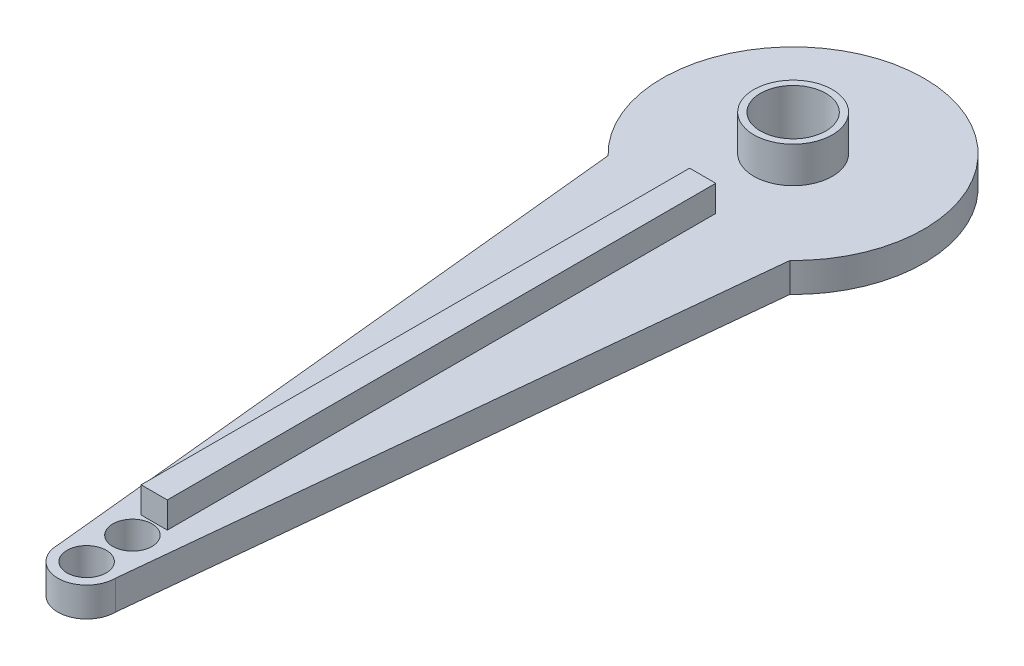
ISO-10303-21;
HEADER;
FILE_DESCRIPTION(('STEP AP214'),'2;1');
FILE_NAME('part.step','',(''),(''),'','','');
FILE_SCHEMA(('AUTOMOTIVE_DESIGN { 1 0 10303 214 1 1 1 1 }'));
ENDSEC;
DATA;
#1=APPLICATION_CONTEXT('core data for automotive mechanical design processes');
#2=APPLICATION_PROTOCOL_DEFINITION('international standard','automotive_design',2000,#1);
#3=PRODUCT_CONTEXT('',#1,'mechanical');
#4=PRODUCT('Part','Part','',(#3));
#5=PRODUCT_RELATED_PRODUCT_CATEGORY('part','',(#4));
#6=PRODUCT_DEFINITION_FORMATION('','',#4);
#7=PRODUCT_DEFINITION_CONTEXT('part definition',#1,'design');
#8=PRODUCT_DEFINITION('design','',#6,#7);
#9=PRODUCT_DEFINITION_SHAPE('','',#8);
#10=(LENGTH_UNIT() NAMED_UNIT(*) SI_UNIT(.MILLI.,.METRE.));
#11=(NAMED_UNIT(*) PLANE_ANGLE_UNIT() SI_UNIT($,.RADIAN.));
#12=(NAMED_UNIT(*) SI_UNIT($,.STERADIAN.) SOLID_ANGLE_UNIT());
#13=UNCERTAINTY_MEASURE_WITH_UNIT(LENGTH_MEASURE(1.E-05),#10,'distance_accuracy_value','');
#14=(GEOMETRIC_REPRESENTATION_CONTEXT(3) GLOBAL_UNCERTAINTY_ASSIGNED_CONTEXT((#13)) GLOBAL_UNIT_ASSIGNED_CONTEXT((#10,
#11,#12)) REPRESENTATION_CONTEXT('',''));
#15=CARTESIAN_POINT('',(0.,0.,0.));
#16=DIRECTION('',(0.,0.,1.));
#17=DIRECTION('',(1.,0.,0.));
#18=AXIS2_PLACEMENT_3D('',#15,#16,#17);
#19=CARTESIAN_POINT('',(0.,1.,0.));
#20=DIRECTION('',(0.,-1.,0.));
#21=DIRECTION('',(0.,0.,-1.));
#22=AXIS2_PLACEMENT_3D('',#19,#20,#21);
#23=PLANE('',#22);
#24=CARTESIAN_POINT('',(0.,1.,0.));
#25=DIRECTION('',(0.,-1.,0.));
#26=DIRECTION('',(0.,0.,-1.));
#27=AXIS2_PLACEMENT_3D('',#24,#25,#26);
#28=CIRCLE('',#27,2.00852796678638);
#29=CARTESIAN_POINT('',(0.,1.,-2.00852796678638));
#30=VERTEX_POINT('',#29);
#31=EDGE_CURVE('E163',#30,#30,#28,.T.);
#32=ORIENTED_EDGE('',*,*,#31,.T.);
#33=EDGE_LOOP('',(#32));
#34=FACE_BOUND('',#33,.T.);
#35=CARTESIAN_POINT('',(0.,1.,0.));
#36=DIRECTION('',(0.,1.,0.));
#37=DIRECTION('',(0.,0.,1.));
#38=AXIS2_PLACEMENT_3D('',#35,#36,#37);
#39=CIRCLE('',#38,2.5);
#40=CARTESIAN_POINT('',(0.,1.,2.5));
#41=VERTEX_POINT('',#40);
#42=EDGE_CURVE('E420',#41,#41,#39,.T.);
#43=ORIENTED_EDGE('',*,*,#42,.T.);
#44=EDGE_LOOP('',(#43));
#45=FACE_BOUND('',#44,.T.);
#46=ADVANCED_FACE('F49',(#34,#45),#23,.F.);
#47=CARTESIAN_POINT('',(0.,2.25,0.));
#48=DIRECTION('',(0.,1.,0.));
#49=DIRECTION('',(0.,0.,1.));
#50=AXIS2_PLACEMENT_3D('',#47,#48,#49);
#51=PLANE('',#50);
#52=DIRECTION('',(-1.,0.,0.));
#53=VECTOR('',#52,1.);
#54=CARTESIAN_POINT('',(-0.999999999999998,2.25,6.91467437760084));
#55=LINE('',#54,#53);
#56=CARTESIAN_POINT('',(1.,2.25,6.91467437760084));
#57=VERTEX_POINT('',#56);
#58=CARTESIAN_POINT('',(-0.999999999999998,2.25,6.91467437760084));
#59=VERTEX_POINT('',#58);
#60=EDGE_CURVE('E120',#57,#59,#55,.T.);
#61=ORIENTED_EDGE('',*,*,#60,.F.);
#62=DIRECTION('',(0.,0.,-1.));
#63=VECTOR('',#62,1.);
#64=CARTESIAN_POINT('',(1.,2.25,48.8343668284656));
#65=LINE('',#64,#63);
#66=CARTESIAN_POINT('',(1.,2.25,48.8343668284656));
#67=VERTEX_POINT('',#66);
#68=EDGE_CURVE('E71',#67,#57,#65,.T.);
#69=ORIENTED_EDGE('',*,*,#68,.F.);
#70=DIRECTION('',(1.,0.,0.));
#71=VECTOR('',#70,1.);
#72=CARTESIAN_POINT('',(-1.,2.25,48.8343668284656));
#73=LINE('',#72,#71);
#74=CARTESIAN_POINT('',(-1.,2.25,48.8343668284656));
#75=VERTEX_POINT('',#74);
#76=EDGE_CURVE('E139',#75,#67,#73,.T.);
#77=ORIENTED_EDGE('',*,*,#76,.F.);
#78=DIRECTION('',(0.,0.,1.));
#79=VECTOR('',#78,1.);
#80=CARTESIAN_POINT('',(-1.,2.25,48.8343668284656));
#81=LINE('',#80,#79);
#82=EDGE_CURVE('E64',#59,#75,#81,.T.);
#83=ORIENTED_EDGE('',*,*,#82,.F.);
#84=EDGE_LOOP('',(#61,#69,#77,#83));
#85=FACE_BOUND('',#84,.T.);
#86=CARTESIAN_POINT('',(0.,2.25,54.));
#87=DIRECTION('',(0.,1.,0.));
#88=DIRECTION('',(0.,0.,1.));
#89=AXIS2_PLACEMENT_3D('',#86,#87,#88);
#90=CIRCLE('',#89,1.5);
#91=CARTESIAN_POINT('',(0.,2.25,55.5));
#92=VERTEX_POINT('',#91);
#93=EDGE_CURVE('E175',#92,#92,#90,.T.);
#94=ORIENTED_EDGE('',*,*,#93,.F.);
#95=EDGE_LOOP('',(#94));
#96=FACE_BOUND('',#95,.T.);
#97=CARTESIAN_POINT('',(0.,2.25,0.));
#98=DIRECTION('',(0.,1.,0.));
#99=DIRECTION('',(0.,0.,1.));
#100=AXIS2_PLACEMENT_3D('',#97,#98,#99);
#101=CIRCLE('',#100,10.);
#102=CARTESIAN_POINT('',(6.94444444444444,2.25,7.19546324832701));
#103=VERTEX_POINT('',#102);
#104=CARTESIAN_POINT('',(-6.94444444444444,2.25,7.19546324832701));
#105=VERTEX_POINT('',#104);
#106=EDGE_CURVE('E181',#103,#105,#101,.T.);
#107=ORIENTED_EDGE('',*,*,#106,.T.);
#108=DIRECTION('',(0.100850381456215,0.,0.99490160345641));
#109=VECTOR('',#108,1.);
#110=CARTESIAN_POINT('',(-6.94444444444444,2.25,7.19546324832701));
#111=LINE('',#110,#109);
#112=CARTESIAN_POINT('',(-2.19999999999999,2.25,54.));
#113=VERTEX_POINT('',#112);
#114=EDGE_CURVE('E184',#105,#113,#111,.T.);
#115=ORIENTED_EDGE('',*,*,#114,.T.);
#116=CARTESIAN_POINT('',(0.,2.25,54.));
#117=DIRECTION('',(0.,1.,0.));
#118=DIRECTION('',(0.,0.,1.));
#119=AXIS2_PLACEMENT_3D('',#116,#117,#118);
#120=CIRCLE('',#119,2.19999999999999);
#121=CARTESIAN_POINT('',(2.2,2.25,54.));
#122=VERTEX_POINT('',#121);
#123=EDGE_CURVE('E187',#113,#122,#120,.T.);
#124=ORIENTED_EDGE('',*,*,#123,.T.);
#125=DIRECTION('',(0.100850381456215,0.,-0.99490160345641));
#126=VECTOR('',#125,1.);
#127=CARTESIAN_POINT('',(2.19999999999999,2.25,54.));
#128=LINE('',#127,#126);
#129=EDGE_CURVE('E189',#122,#103,#128,.T.);
#130=ORIENTED_EDGE('',*,*,#129,.T.);
#131=EDGE_LOOP('',(#107,#115,#124,#130));
#132=FACE_BOUND('',#131,.T.);
#133=CARTESIAN_POINT('',(0.,2.25,50.5));
#134=DIRECTION('',(0.,1.,0.));
#135=DIRECTION('',(0.,0.,1.));
#136=AXIS2_PLACEMENT_3D('',#133,#134,#135);
#137=CIRCLE('',#136,1.5);
#138=CARTESIAN_POINT('',(0.,2.25,52.));
#139=VERTEX_POINT('',#138);
#140=EDGE_CURVE('E169',#139,#139,#137,.T.);
#141=ORIENTED_EDGE('',*,*,#140,.F.);
#142=EDGE_LOOP('',(#141));
#143=FACE_BOUND('',#142,.T.);
#144=CARTESIAN_POINT('',(0.,2.25,0.));
#145=DIRECTION('',(0.,1.,0.));
#146=DIRECTION('',(0.,0.,1.));
#147=AXIS2_PLACEMENT_3D('',#144,#145,#146);
#148=CIRCLE('',#147,3.);
#149=CARTESIAN_POINT('',(0.,2.25,3.));
#150=VERTEX_POINT('',#149);
#151=EDGE_CURVE('E144',#150,#150,#148,.T.);
#152=ORIENTED_EDGE('',*,*,#151,.F.);
#153=EDGE_LOOP('',(#152));
#154=FACE_BOUND('',#153,.T.);
#155=ADVANCED_FACE('F224',(#85,#96,#132,#143,#154),#51,.T.);
#156=CARTESIAN_POINT('',(0.,0.,0.));
#157=DIRECTION('',(0.,1.,0.));
#158=DIRECTION('',(0.,0.,1.));
#159=AXIS2_PLACEMENT_3D('',#156,#157,#158);
#160=PLANE('',#159);
#161=CARTESIAN_POINT('',(0.,0.,0.));
#162=DIRECTION('',(0.,-1.,0.));
#163=DIRECTION('',(0.,0.,-1.));
#164=AXIS2_PLACEMENT_3D('',#161,#162,#163);
#165=CIRCLE('',#164,2.00852796678638);
#166=CARTESIAN_POINT('',(0.,0.,-2.00852796678638));
#167=VERTEX_POINT('',#166);
#168=EDGE_CURVE('E160',#167,#167,#165,.T.);
#169=ORIENTED_EDGE('',*,*,#168,.F.);
#170=EDGE_LOOP('',(#169));
#171=FACE_BOUND('',#170,.T.);
#172=CARTESIAN_POINT('',(0.,0.,0.));
#173=DIRECTION('',(0.,-1.,0.));
#174=DIRECTION('',(0.,0.,-1.));
#175=AXIS2_PLACEMENT_3D('',#172,#173,#174);
#176=CIRCLE('',#175,3.);
#177=CARTESIAN_POINT('',(0.,0.,-3.));
#178=VERTEX_POINT('',#177);
#179=EDGE_CURVE('E150',#178,#178,#176,.T.);
#180=ORIENTED_EDGE('',*,*,#179,.T.);
#181=EDGE_LOOP('',(#180));
#182=FACE_BOUND('',#181,.T.);
#183=ADVANCED_FACE('F241',(#171,#182),#160,.F.);
#184=CARTESIAN_POINT('',(0.,0.,0.));
#185=DIRECTION('',(0.,-1.,0.));
#186=DIRECTION('',(0.,0.,-1.));
#187=AXIS2_PLACEMENT_3D('',#184,#185,#186);
#188=CIRCLE('',#187,3.8);
#189=CARTESIAN_POINT('',(0.,0.,-3.8));
#190=VERTEX_POINT('',#189);
#191=EDGE_CURVE('E154',#190,#190,#188,.T.);
#192=ORIENTED_EDGE('',*,*,#191,.F.);
#193=EDGE_LOOP('',(#192));
#194=FACE_BOUND('',#193,.T.);
#195=CARTESIAN_POINT('',(0.,0.,0.));
#196=DIRECTION('',(0.,1.,0.));
#197=DIRECTION('',(0.,0.,1.));
#198=AXIS2_PLACEMENT_3D('',#195,#196,#197);
#199=CIRCLE('',#198,10.);
#200=CARTESIAN_POINT('',(6.94444444444444,0.,7.19546324832701));
#201=VERTEX_POINT('',#200);
#202=CARTESIAN_POINT('',(-6.94444444444444,0.,7.19546324832701));
#203=VERTEX_POINT('',#202);
#204=EDGE_CURVE('E178',#201,#203,#199,.T.);
#205=ORIENTED_EDGE('',*,*,#204,.F.);
#206=DIRECTION('',(0.100850381456215,0.,-0.99490160345641));
#207=VECTOR('',#206,1.);
#208=CARTESIAN_POINT('',(2.19999999999999,0.,54.));
#209=LINE('',#208,#207);
#210=CARTESIAN_POINT('',(2.2,0.,54.));
#211=VERTEX_POINT('',#210);
#212=EDGE_CURVE('E185',#211,#201,#209,.T.);
#213=ORIENTED_EDGE('',*,*,#212,.F.);
#214=CARTESIAN_POINT('',(0.,0.,54.));
#215=DIRECTION('',(0.,1.,0.));
#216=DIRECTION('',(0.,0.,1.));
#217=AXIS2_PLACEMENT_3D('',#214,#215,#216);
#218=CIRCLE('',#217,2.19999999999999);
#219=CARTESIAN_POINT('',(-2.19999999999999,0.,54.));
#220=VERTEX_POINT('',#219);
#221=EDGE_CURVE('E196',#220,#211,#218,.T.);
#222=ORIENTED_EDGE('',*,*,#221,.F.);
#223=DIRECTION('',(0.100850381456215,0.,0.99490160345641));
#224=VECTOR('',#223,1.);
#225=CARTESIAN_POINT('',(-6.94444444444444,0.,7.19546324832701));
#226=LINE('',#225,#224);
#227=EDGE_CURVE('E194',#203,#220,#226,.T.);
#228=ORIENTED_EDGE('',*,*,#227,.F.);
#229=EDGE_LOOP('',(#205,#213,#222,#228));
#230=FACE_BOUND('',#229,.T.);
#231=CARTESIAN_POINT('',(0.,0.,54.));
#232=DIRECTION('',(0.,1.,0.));
#233=DIRECTION('',(0.,0.,1.));
#234=AXIS2_PLACEMENT_3D('',#231,#232,#233);
#235=CIRCLE('',#234,1.5);
#236=CARTESIAN_POINT('',(0.,0.,55.5));
#237=VERTEX_POINT('',#236);
#238=EDGE_CURVE('E172',#237,#237,#235,.T.);
#239=ORIENTED_EDGE('',*,*,#238,.T.);
#240=EDGE_LOOP('',(#239));
#241=FACE_BOUND('',#240,.T.);
#242=CARTESIAN_POINT('',(0.,0.,50.5));
#243=DIRECTION('',(0.,1.,0.));
#244=DIRECTION('',(0.,0.,1.));
#245=AXIS2_PLACEMENT_3D('',#242,#243,#244);
#246=CIRCLE('',#245,1.5);
#247=CARTESIAN_POINT('',(0.,0.,52.));
#248=VERTEX_POINT('',#247);
#249=EDGE_CURVE('E166',#248,#248,#246,.T.);
#250=ORIENTED_EDGE('',*,*,#249,.T.);
#251=EDGE_LOOP('',(#250));
#252=FACE_BOUND('',#251,.T.);
#253=ADVANCED_FACE('F214',(#194,#230,#241,#252),#160,.F.);
#254=CARTESIAN_POINT('',(0.,2.25,0.));
#255=DIRECTION('',(0.,-1.,0.));
#256=DIRECTION('',(0.,0.,-1.));
#257=AXIS2_PLACEMENT_3D('',#254,#255,#256);
#258=CYLINDRICAL_SURFACE('',#257,10.);
#259=ORIENTED_EDGE('',*,*,#204,.T.);
#260=DIRECTION('',(0.,-1.,0.));
#261=VECTOR('',#260,1.);
#262=CARTESIAN_POINT('',(-6.94444444444444,2.25,7.19546324832701));
#263=LINE('',#262,#261);
#264=EDGE_CURVE('E11',#105,#203,#263,.T.);
#265=ORIENTED_EDGE('',*,*,#264,.F.);
#266=ORIENTED_EDGE('',*,*,#106,.F.);
#267=DIRECTION('',(0.,-1.,0.));
#268=VECTOR('',#267,1.);
#269=CARTESIAN_POINT('',(6.94444444444444,2.25,7.19546324832701));
#270=LINE('',#269,#268);
#271=EDGE_CURVE('E191',#103,#201,#270,.T.);
#272=ORIENTED_EDGE('',*,*,#271,.T.);
#273=EDGE_LOOP('',(#259,#265,#266,#272));
#274=FACE_BOUND('',#273,.T.);
#275=ADVANCED_FACE('F51',(#274),#258,.T.);
#276=CARTESIAN_POINT('',(-6.94444444444444,2.25,7.19546324832701));
#277=DIRECTION('',(0.99490160345641,0.,-0.100850381456215));
#278=DIRECTION('',(-0.100850381456215,0.,-0.99490160345641));
#279=AXIS2_PLACEMENT_3D('',#276,#277,#278);
#280=PLANE('',#279);
#281=ORIENTED_EDGE('',*,*,#227,.T.);
#282=DIRECTION('',(0.,-1.,0.));
#283=VECTOR('',#282,1.);
#284=CARTESIAN_POINT('',(-2.19999999999999,2.25,54.));
#285=LINE('',#284,#283);
#286=EDGE_CURVE('E57',#113,#220,#285,.T.);
#287=ORIENTED_EDGE('',*,*,#286,.F.);
#288=ORIENTED_EDGE('',*,*,#114,.F.);
#289=ORIENTED_EDGE('',*,*,#264,.T.);
#290=EDGE_LOOP('',(#281,#287,#288,#289));
#291=FACE_BOUND('',#290,.T.);
#292=ADVANCED_FACE('F226',(#291),#280,.F.);
#293=CARTESIAN_POINT('',(0.,2.25,54.));
#294=DIRECTION('',(0.,-1.,0.));
#295=DIRECTION('',(0.,0.,-1.));
#296=AXIS2_PLACEMENT_3D('',#293,#294,#295);
#297=CYLINDRICAL_SURFACE('',#296,2.19999999999999);
#298=ORIENTED_EDGE('',*,*,#221,.T.);
#299=DIRECTION('',(0.,-1.,0.));
#300=VECTOR('',#299,1.);
#301=CARTESIAN_POINT('',(2.2,2.25,54.));
#302=LINE('',#301,#300);
#303=EDGE_CURVE('E201',#122,#211,#302,.T.);
#304=ORIENTED_EDGE('',*,*,#303,.F.);
#305=ORIENTED_EDGE('',*,*,#123,.F.);
#306=ORIENTED_EDGE('',*,*,#286,.T.);
#307=EDGE_LOOP('',(#298,#304,#305,#306));
#308=FACE_BOUND('',#307,.T.);
#309=ADVANCED_FACE('F208',(#308),#297,.T.);
#310=CARTESIAN_POINT('',(2.19999999999999,2.25,54.));
#311=DIRECTION('',(-0.99490160345641,0.,-0.100850381456215));
#312=DIRECTION('',(-0.100850381456215,0.,0.99490160345641));
#313=AXIS2_PLACEMENT_3D('',#310,#311,#312);
#314=PLANE('',#313);
#315=ORIENTED_EDGE('',*,*,#212,.T.);
#316=ORIENTED_EDGE('',*,*,#271,.F.);
#317=ORIENTED_EDGE('',*,*,#129,.F.);
#318=ORIENTED_EDGE('',*,*,#303,.T.);
#319=EDGE_LOOP('',(#315,#316,#317,#318));
#320=FACE_BOUND('',#319,.T.);
#321=ADVANCED_FACE('F218',(#320),#314,.F.);
#322=CARTESIAN_POINT('',(0.,2.25,54.));
#323=DIRECTION('',(0.,-1.,0.));
#324=DIRECTION('',(0.,0.,-1.));
#325=AXIS2_PLACEMENT_3D('',#322,#323,#324);
#326=CYLINDRICAL_SURFACE('',#325,1.5);
#327=ORIENTED_EDGE('',*,*,#93,.T.);
#328=EDGE_LOOP('',(#327));
#329=FACE_BOUND('',#328,.T.);
#330=ORIENTED_EDGE('',*,*,#238,.F.);
#331=EDGE_LOOP('',(#330));
#332=FACE_BOUND('',#331,.T.);
#333=ADVANCED_FACE('F251',(#329,#332),#326,.F.);
#334=CARTESIAN_POINT('',(0.,2.25,50.5));
#335=DIRECTION('',(0.,-1.,0.));
#336=DIRECTION('',(0.,0.,-1.));
#337=AXIS2_PLACEMENT_3D('',#334,#335,#336);
#338=CYLINDRICAL_SURFACE('',#337,1.5);
#339=ORIENTED_EDGE('',*,*,#140,.T.);
#340=EDGE_LOOP('',(#339));
#341=FACE_BOUND('',#340,.T.);
#342=ORIENTED_EDGE('',*,*,#249,.F.);
#343=EDGE_LOOP('',(#342));
#344=FACE_BOUND('',#343,.T.);
#345=ADVANCED_FACE('F248',(#341,#344),#338,.F.);
#346=CARTESIAN_POINT('',(0.,1.,0.));
#347=DIRECTION('',(0.,-1.,0.));
#348=DIRECTION('',(0.,0.,-1.));
#349=AXIS2_PLACEMENT_3D('',#346,#347,#348);
#350=CYLINDRICAL_SURFACE('',#349,2.00852796678638);
#351=ORIENTED_EDGE('',*,*,#31,.F.);
#352=EDGE_LOOP('',(#351));
#353=FACE_BOUND('',#352,.T.);
#354=ORIENTED_EDGE('',*,*,#168,.T.);
#355=EDGE_LOOP('',(#354));
#356=FACE_BOUND('',#355,.T.);
#357=ADVANCED_FACE('F246',(#353,#356),#350,.F.);
#358=CARTESIAN_POINT('',(0.,0.5,0.));
#359=DIRECTION('',(0.,-1.,0.));
#360=DIRECTION('',(0.,0.,-1.));
#361=AXIS2_PLACEMENT_3D('',#358,#359,#360);
#362=CYLINDRICAL_SURFACE('',#361,3.8);
#363=CARTESIAN_POINT('',(0.,0.5,0.));
#364=DIRECTION('',(0.,-1.,0.));
#365=DIRECTION('',(0.,0.,-1.));
#366=AXIS2_PLACEMENT_3D('',#363,#364,#365);
#367=CIRCLE('',#366,3.8);
#368=CARTESIAN_POINT('',(0.,0.5,-3.8));
#369=VERTEX_POINT('',#368);
#370=EDGE_CURVE('E157',#369,#369,#367,.T.);
#371=ORIENTED_EDGE('',*,*,#370,.F.);
#372=EDGE_LOOP('',(#371));
#373=FACE_BOUND('',#372,.T.);
#374=ORIENTED_EDGE('',*,*,#191,.T.);
#375=EDGE_LOOP('',(#374));
#376=FACE_BOUND('',#375,.T.);
#377=ADVANCED_FACE('F282',(#373,#376),#362,.F.);
#378=CARTESIAN_POINT('',(0.,0.5,0.));
#379=DIRECTION('',(0.,-1.,0.));
#380=DIRECTION('',(0.,0.,-1.));
#381=AXIS2_PLACEMENT_3D('',#378,#379,#380);
#382=PLANE('',#381);
#383=CARTESIAN_POINT('',(0.,0.5,0.));
#384=DIRECTION('',(0.,-1.,0.));
#385=DIRECTION('',(0.,0.,-1.));
#386=AXIS2_PLACEMENT_3D('',#383,#384,#385);
#387=CIRCLE('',#386,3.);
#388=CARTESIAN_POINT('',(0.,0.5,-3.));
#389=VERTEX_POINT('',#388);
#390=EDGE_CURVE('E151',#389,#389,#387,.T.);
#391=ORIENTED_EDGE('',*,*,#390,.F.);
#392=EDGE_LOOP('',(#391));
#393=FACE_BOUND('',#392,.T.);
#394=ORIENTED_EDGE('',*,*,#370,.T.);
#395=EDGE_LOOP('',(#394));
#396=FACE_BOUND('',#395,.T.);
#397=ADVANCED_FACE('F310',(#393,#396),#382,.T.);
#398=CARTESIAN_POINT('',(0.,0.5,0.));
#399=DIRECTION('',(0.,-1.,0.));
#400=DIRECTION('',(0.,0.,-1.));
#401=AXIS2_PLACEMENT_3D('',#398,#399,#400);
#402=CYLINDRICAL_SURFACE('',#401,3.);
#403=ORIENTED_EDGE('',*,*,#390,.T.);
#404=EDGE_LOOP('',(#403));
#405=FACE_BOUND('',#404,.T.);
#406=ORIENTED_EDGE('',*,*,#179,.F.);
#407=EDGE_LOOP('',(#406));
#408=FACE_BOUND('',#407,.T.);
#409=ADVANCED_FACE('F317',(#405,#408),#402,.T.);
#410=CARTESIAN_POINT('',(1.,4.25,48.8343668284656));
#411=DIRECTION('',(-1.,0.,0.));
#412=DIRECTION('',(0.,0.,1.));
#413=AXIS2_PLACEMENT_3D('',#410,#411,#412);
#414=PLANE('',#413);
#415=ORIENTED_EDGE('',*,*,#68,.T.);
#416=DIRECTION('',(0.,1.,0.));
#417=VECTOR('',#416,1.);
#418=CARTESIAN_POINT('',(1.,-1.49503218533484,6.91467437760084));
#419=LINE('',#418,#417);
#420=CARTESIAN_POINT('',(1.,4.25,6.91467437760084));
#421=VERTEX_POINT('',#420);
#422=EDGE_CURVE('E122',#57,#421,#419,.T.);
#423=ORIENTED_EDGE('',*,*,#422,.T.);
#424=DIRECTION('',(0.,0.,-1.));
#425=VECTOR('',#424,1.);
#426=CARTESIAN_POINT('',(1.,4.25,48.8343668284656));
#427=LINE('',#426,#425);
#428=CARTESIAN_POINT('',(1.,4.25,48.8343668284656));
#429=VERTEX_POINT('',#428);
#430=EDGE_CURVE('E129',#429,#421,#427,.T.);
#431=ORIENTED_EDGE('',*,*,#430,.F.);
#432=DIRECTION('',(0.,-1.,0.));
#433=VECTOR('',#432,1.);
#434=CARTESIAN_POINT('',(1.,4.25,48.8343668284656));
#435=LINE('',#434,#433);
#436=EDGE_CURVE('E137',#429,#67,#435,.T.);
#437=ORIENTED_EDGE('',*,*,#436,.T.);
#438=EDGE_LOOP('',(#415,#423,#431,#437));
#439=FACE_BOUND('',#438,.T.);
#440=ADVANCED_FACE('F325',(#439),#414,.F.);
#441=CARTESIAN_POINT('',(-1.,4.25,48.8343668284656));
#442=DIRECTION('',(1.,0.,0.));
#443=DIRECTION('',(0.,0.,-1.));
#444=AXIS2_PLACEMENT_3D('',#441,#442,#443);
#445=PLANE('',#444);
#446=DIRECTION('',(0.,0.,1.));
#447=VECTOR('',#446,1.);
#448=CARTESIAN_POINT('',(-1.,4.25,48.8343668284656));
#449=LINE('',#448,#447);
#450=CARTESIAN_POINT('',(-0.999999999999998,4.25,6.91467437760084));
#451=VERTEX_POINT('',#450);
#452=CARTESIAN_POINT('',(-1.,4.25,48.8343668284656));
#453=VERTEX_POINT('',#452);
#454=EDGE_CURVE('E127',#451,#453,#449,.T.);
#455=ORIENTED_EDGE('',*,*,#454,.F.);
#456=DIRECTION('',(0.,1.,0.));
#457=VECTOR('',#456,1.);
#458=CARTESIAN_POINT('',(-0.999999999999998,-1.49503218533484,6.91467437760084));
#459=LINE('',#458,#457);
#460=EDGE_CURVE('E115',#59,#451,#459,.T.);
#461=ORIENTED_EDGE('',*,*,#460,.F.);
#462=ORIENTED_EDGE('',*,*,#82,.T.);
#463=DIRECTION('',(0.,-1.,0.));
#464=VECTOR('',#463,1.);
#465=CARTESIAN_POINT('',(-1.,4.25,48.8343668284656));
#466=LINE('',#465,#464);
#467=EDGE_CURVE('E133',#453,#75,#466,.T.);
#468=ORIENTED_EDGE('',*,*,#467,.F.);
#469=EDGE_LOOP('',(#455,#461,#462,#468));
#470=FACE_BOUND('',#469,.T.);
#471=ADVANCED_FACE('F131',(#470),#445,.F.);
#472=CARTESIAN_POINT('',(-1.,4.25,48.8343668284656));
#473=DIRECTION('',(0.,0.,-1.));
#474=DIRECTION('',(-1.,0.,0.));
#475=AXIS2_PLACEMENT_3D('',#472,#473,#474);
#476=PLANE('',#475);
#477=ORIENTED_EDGE('',*,*,#76,.T.);
#478=ORIENTED_EDGE('',*,*,#436,.F.);
#479=DIRECTION('',(1.,0.,0.));
#480=VECTOR('',#479,1.);
#481=CARTESIAN_POINT('',(-1.,4.25,48.8343668284656));
#482=LINE('',#481,#480);
#483=EDGE_CURVE('E135',#453,#429,#482,.T.);
#484=ORIENTED_EDGE('',*,*,#483,.F.);
#485=ORIENTED_EDGE('',*,*,#467,.T.);
#486=EDGE_LOOP('',(#477,#478,#484,#485));
#487=FACE_BOUND('',#486,.T.);
#488=ADVANCED_FACE('F332',(#487),#476,.F.);
#489=CARTESIAN_POINT('',(0.,4.25,0.));
#490=DIRECTION('',(0.,-1.,0.));
#491=DIRECTION('',(0.,0.,-1.));
#492=AXIS2_PLACEMENT_3D('',#489,#490,#491);
#493=PLANE('',#492);
#494=ORIENTED_EDGE('',*,*,#430,.T.);
#495=DIRECTION('',(1.,0.,0.));
#496=VECTOR('',#495,1.);
#497=CARTESIAN_POINT('',(-0.999999999999998,4.25,6.91467437760084));
#498=LINE('',#497,#496);
#499=EDGE_CURVE('E118',#451,#421,#498,.T.);
#500=ORIENTED_EDGE('',*,*,#499,.F.);
#501=ORIENTED_EDGE('',*,*,#454,.T.);
#502=ORIENTED_EDGE('',*,*,#483,.T.);
#503=EDGE_LOOP('',(#494,#500,#501,#502));
#504=FACE_BOUND('',#503,.T.);
#505=ADVANCED_FACE('F126',(#504),#493,.F.);
#506=CARTESIAN_POINT('',(0.,5.,0.));
#507=DIRECTION('',(0.,1.,0.));
#508=DIRECTION('',(0.,0.,1.));
#509=AXIS2_PLACEMENT_3D('',#506,#507,#508);
#510=PLANE('',#509);
#511=CARTESIAN_POINT('',(0.,5.,0.));
#512=DIRECTION('',(0.,1.,0.));
#513=DIRECTION('',(0.,0.,1.));
#514=AXIS2_PLACEMENT_3D('',#511,#512,#513);
#515=CIRCLE('',#514,3.);
#516=CARTESIAN_POINT('',(0.,5.,3.));
#517=VERTEX_POINT('',#516);
#518=EDGE_CURVE('E428',#517,#517,#515,.T.);
#519=ORIENTED_EDGE('',*,*,#518,.T.);
#520=EDGE_LOOP('',(#519));
#521=FACE_BOUND('',#520,.T.);
#522=CARTESIAN_POINT('',(0.,5.,0.));
#523=DIRECTION('',(0.,1.,0.));
#524=DIRECTION('',(0.,0.,1.));
#525=AXIS2_PLACEMENT_3D('',#522,#523,#524);
#526=CIRCLE('',#525,2.5);
#527=CARTESIAN_POINT('',(0.,5.,2.5));
#528=VERTEX_POINT('',#527);
#529=EDGE_CURVE('E423',#528,#528,#526,.T.);
#530=ORIENTED_EDGE('',*,*,#529,.F.);
#531=EDGE_LOOP('',(#530));
#532=FACE_BOUND('',#531,.T.);
#533=ADVANCED_FACE('F353',(#521,#532),#510,.T.);
#534=CARTESIAN_POINT('',(0.,5.,0.));
#535=DIRECTION('',(0.,-1.,0.));
#536=DIRECTION('',(0.,0.,-1.));
#537=AXIS2_PLACEMENT_3D('',#534,#535,#536);
#538=CYLINDRICAL_SURFACE('',#537,3.);
#539=ORIENTED_EDGE('',*,*,#151,.T.);
#540=EDGE_LOOP('',(#539));
#541=FACE_BOUND('',#540,.T.);
#542=ORIENTED_EDGE('',*,*,#518,.F.);
#543=EDGE_LOOP('',(#542));
#544=FACE_BOUND('',#543,.T.);
#545=ADVANCED_FACE('F377',(#541,#544),#538,.T.);
#546=CARTESIAN_POINT('',(0.,5.,0.));
#547=DIRECTION('',(0.,-1.,0.));
#548=DIRECTION('',(0.,0.,-1.));
#549=AXIS2_PLACEMENT_3D('',#546,#547,#548);
#550=CYLINDRICAL_SURFACE('',#549,2.5);
#551=ORIENTED_EDGE('',*,*,#529,.T.);
#552=EDGE_LOOP('',(#551));
#553=FACE_BOUND('',#552,.T.);
#554=ORIENTED_EDGE('',*,*,#42,.F.);
#555=EDGE_LOOP('',(#554));
#556=FACE_BOUND('',#555,.T.);
#557=ADVANCED_FACE('F386',(#553,#556),#550,.F.);
#558=CARTESIAN_POINT('',(-0.999999999999998,-1.49503218533484,6.91467437760084));
#559=DIRECTION('',(0.,0.,1.));
#560=DIRECTION('',(1.,0.,0.));
#561=AXIS2_PLACEMENT_3D('',#558,#559,#560);
#562=PLANE('',#561);
#563=ORIENTED_EDGE('',*,*,#60,.T.);
#564=ORIENTED_EDGE('',*,*,#460,.T.);
#565=ORIENTED_EDGE('',*,*,#499,.T.);
#566=ORIENTED_EDGE('',*,*,#422,.F.);
#567=EDGE_LOOP('',(#563,#564,#565,#566));
#568=FACE_BOUND('',#567,.T.);
#569=ADVANCED_FACE('F117',(#568),#562,.F.);
#570=CLOSED_SHELL('',(#46,#155,#183,#253,#275,#292,#309,#321,#333,#345,#357,#377,#397,#409,#440,
#471,#488,#505,#533,#545,#557,#569));
#571=MANIFOLD_SOLID_BREP('B2',#570);
#572=ADVANCED_BREP_SHAPE_REPRESENTATION('',(#18,#571),#14);
#573=SHAPE_DEFINITION_REPRESENTATION(#9,#572);
ENDSEC;
END-ISO-10303-21;
